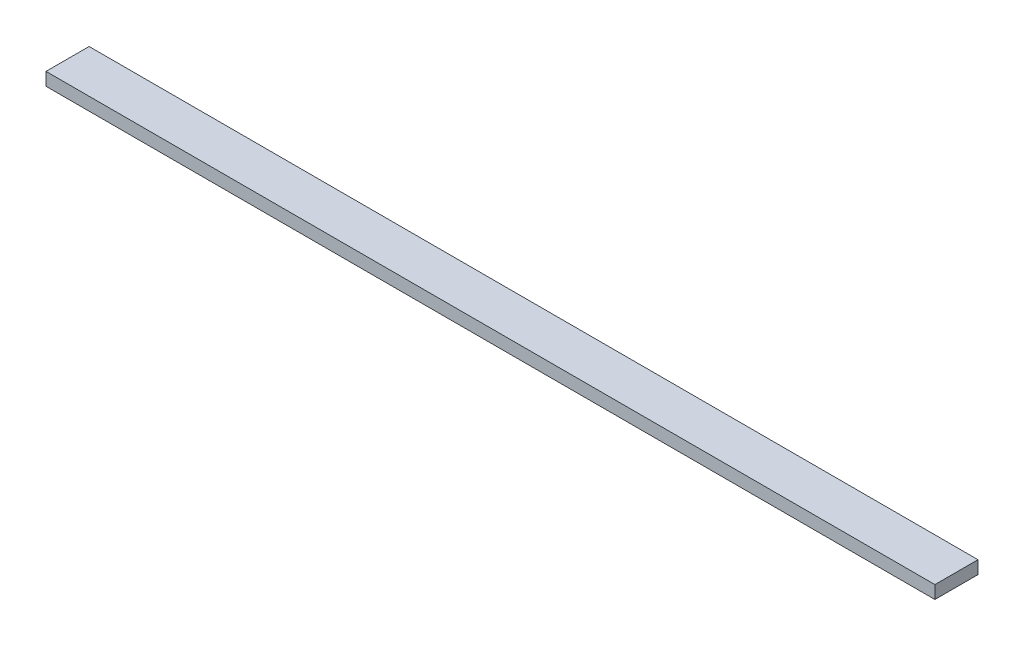
ISO-10303-21;
HEADER;
FILE_DESCRIPTION(('STEP AP214'),'2;1');
FILE_NAME('part.step','',(''),(''),'','','');
FILE_SCHEMA(('AUTOMOTIVE_DESIGN { 1 0 10303 214 1 1 1 1 }'));
ENDSEC;
DATA;
#1=APPLICATION_CONTEXT('core data for automotive mechanical design processes');
#2=APPLICATION_PROTOCOL_DEFINITION('international standard','automotive_design',2000,#1);
#3=PRODUCT_CONTEXT('',#1,'mechanical');
#4=PRODUCT('Part','Part','',(#3));
#5=PRODUCT_RELATED_PRODUCT_CATEGORY('part','',(#4));
#6=PRODUCT_DEFINITION_FORMATION('','',#4);
#7=PRODUCT_DEFINITION_CONTEXT('part definition',#1,'design');
#8=PRODUCT_DEFINITION('design','',#6,#7);
#9=PRODUCT_DEFINITION_SHAPE('','',#8);
#10=(LENGTH_UNIT() NAMED_UNIT(*) SI_UNIT(.MILLI.,.METRE.));
#11=(NAMED_UNIT(*) PLANE_ANGLE_UNIT() SI_UNIT($,.RADIAN.));
#12=(NAMED_UNIT(*) SI_UNIT($,.STERADIAN.) SOLID_ANGLE_UNIT());
#13=UNCERTAINTY_MEASURE_WITH_UNIT(LENGTH_MEASURE(1.E-05),#10,'distance_accuracy_value','');
#14=(GEOMETRIC_REPRESENTATION_CONTEXT(3) GLOBAL_UNCERTAINTY_ASSIGNED_CONTEXT((#13)) GLOBAL_UNIT_ASSIGNED_CONTEXT((#10,
#11,#12)) REPRESENTATION_CONTEXT('',''));
#15=CARTESIAN_POINT('',(0.,0.,0.));
#16=DIRECTION('',(0.,0.,1.));
#17=DIRECTION('',(1.,0.,0.));
#18=AXIS2_PLACEMENT_3D('',#15,#16,#17);
#19=CARTESIAN_POINT('',(-103.12,3.,-9.99999999999997));
#20=DIRECTION('',(0.,0.,1.));
#21=DIRECTION('',(1.,0.,0.));
#22=AXIS2_PLACEMENT_3D('',#19,#20,#21);
#23=PLANE('',#22);
#24=DIRECTION('',(-1.,0.,0.));
#25=VECTOR('',#24,1.);
#26=CARTESIAN_POINT('',(-103.12,0.,-9.99999999999997));
#27=LINE('',#26,#25);
#28=CARTESIAN_POINT('',(103.12,0.,-9.99999999999997));
#29=VERTEX_POINT('',#28);
#30=CARTESIAN_POINT('',(-103.12,0.,-9.99999999999997));
#31=VERTEX_POINT('',#30);
#32=EDGE_CURVE('E99',#29,#31,#27,.T.);
#33=ORIENTED_EDGE('',*,*,#32,.T.);
#34=DIRECTION('',(0.,-1.,0.));
#35=VECTOR('',#34,1.);
#36=CARTESIAN_POINT('',(-103.12,3.,-9.99999999999997));
#37=LINE('',#36,#35);
#38=CARTESIAN_POINT('',(-103.12,3.,-9.99999999999997));
#39=VERTEX_POINT('',#38);
#40=EDGE_CURVE('E11',#39,#31,#37,.T.);
#41=ORIENTED_EDGE('',*,*,#40,.F.);
#42=DIRECTION('',(-1.,0.,0.));
#43=VECTOR('',#42,1.);
#44=CARTESIAN_POINT('',(-103.12,3.,-9.99999999999997));
#45=LINE('',#44,#43);
#46=CARTESIAN_POINT('',(103.12,3.,-9.99999999999997));
#47=VERTEX_POINT('',#46);
#48=EDGE_CURVE('E87',#47,#39,#45,.T.);
#49=ORIENTED_EDGE('',*,*,#48,.F.);
#50=DIRECTION('',(0.,-1.,0.));
#51=VECTOR('',#50,1.);
#52=CARTESIAN_POINT('',(103.12,3.,-9.99999999999997));
#53=LINE('',#52,#51);
#54=EDGE_CURVE('E95',#47,#29,#53,.T.);
#55=ORIENTED_EDGE('',*,*,#54,.T.);
#56=EDGE_LOOP('',(#33,#41,#49,#55));
#57=FACE_BOUND('',#56,.T.);
#58=ADVANCED_FACE('F36',(#57),#23,.F.);
#59=CARTESIAN_POINT('',(-103.12,3.,0.));
#60=DIRECTION('',(1.,0.,0.));
#61=DIRECTION('',(0.,0.,-1.));
#62=AXIS2_PLACEMENT_3D('',#59,#60,#61);
#63=PLANE('',#62);
#64=DIRECTION('',(0.,0.,1.));
#65=VECTOR('',#64,1.);
#66=CARTESIAN_POINT('',(-103.12,0.,0.));
#67=LINE('',#66,#65);
#68=CARTESIAN_POINT('',(-103.12,0.,0.));
#69=VERTEX_POINT('',#68);
#70=EDGE_CURVE('E91',#31,#69,#67,.T.);
#71=ORIENTED_EDGE('',*,*,#70,.T.);
#72=DIRECTION('',(0.,-1.,0.));
#73=VECTOR('',#72,1.);
#74=CARTESIAN_POINT('',(-103.12,3.,0.));
#75=LINE('',#74,#73);
#76=CARTESIAN_POINT('',(-103.12,3.,0.));
#77=VERTEX_POINT('',#76);
#78=EDGE_CURVE('E44',#77,#69,#75,.T.);
#79=ORIENTED_EDGE('',*,*,#78,.F.);
#80=DIRECTION('',(0.,0.,1.));
#81=VECTOR('',#80,1.);
#82=CARTESIAN_POINT('',(-103.12,3.,0.));
#83=LINE('',#82,#81);
#84=EDGE_CURVE('E82',#39,#77,#83,.T.);
#85=ORIENTED_EDGE('',*,*,#84,.F.);
#86=ORIENTED_EDGE('',*,*,#40,.T.);
#87=EDGE_LOOP('',(#71,#79,#85,#86));
#88=FACE_BOUND('',#87,.T.);
#89=ADVANCED_FACE('F90',(#88),#63,.F.);
#90=CARTESIAN_POINT('',(103.12,3.,0.));
#91=DIRECTION('',(0.,0.,-1.));
#92=DIRECTION('',(-1.,0.,0.));
#93=AXIS2_PLACEMENT_3D('',#90,#91,#92);
#94=PLANE('',#93);
#95=DIRECTION('',(1.,0.,0.));
#96=VECTOR('',#95,1.);
#97=CARTESIAN_POINT('',(103.12,0.,0.));
#98=LINE('',#97,#96);
#99=CARTESIAN_POINT('',(103.12,0.,0.));
#100=VERTEX_POINT('',#99);
#101=EDGE_CURVE('E69',#69,#100,#98,.T.);
#102=ORIENTED_EDGE('',*,*,#101,.T.);
#103=DIRECTION('',(0.,-1.,0.));
#104=VECTOR('',#103,1.);
#105=CARTESIAN_POINT('',(103.12,3.,0.));
#106=LINE('',#105,#104);
#107=CARTESIAN_POINT('',(103.12,3.,0.));
#108=VERTEX_POINT('',#107);
#109=EDGE_CURVE('E92',#108,#100,#106,.T.);
#110=ORIENTED_EDGE('',*,*,#109,.F.);
#111=DIRECTION('',(1.,0.,0.));
#112=VECTOR('',#111,1.);
#113=CARTESIAN_POINT('',(103.12,3.,0.));
#114=LINE('',#113,#112);
#115=EDGE_CURVE('E85',#77,#108,#114,.T.);
#116=ORIENTED_EDGE('',*,*,#115,.F.);
#117=ORIENTED_EDGE('',*,*,#78,.T.);
#118=EDGE_LOOP('',(#102,#110,#116,#117));
#119=FACE_BOUND('',#118,.T.);
#120=ADVANCED_FACE('F93',(#119),#94,.F.);
#121=CARTESIAN_POINT('',(103.12,3.,-9.99999999999997));
#122=DIRECTION('',(-1.,0.,0.));
#123=DIRECTION('',(0.,0.,1.));
#124=AXIS2_PLACEMENT_3D('',#121,#122,#123);
#125=PLANE('',#124);
#126=DIRECTION('',(0.,0.,-1.));
#127=VECTOR('',#126,1.);
#128=CARTESIAN_POINT('',(103.12,0.,-9.99999999999997));
#129=LINE('',#128,#127);
#130=EDGE_CURVE('E75',#100,#29,#129,.T.);
#131=ORIENTED_EDGE('',*,*,#130,.T.);
#132=ORIENTED_EDGE('',*,*,#54,.F.);
#133=DIRECTION('',(0.,0.,-1.));
#134=VECTOR('',#133,1.);
#135=CARTESIAN_POINT('',(103.12,3.,-9.99999999999997));
#136=LINE('',#135,#134);
#137=EDGE_CURVE('E52',#108,#47,#136,.T.);
#138=ORIENTED_EDGE('',*,*,#137,.F.);
#139=ORIENTED_EDGE('',*,*,#109,.T.);
#140=EDGE_LOOP('',(#131,#132,#138,#139));
#141=FACE_BOUND('',#140,.T.);
#142=ADVANCED_FACE('F106',(#141),#125,.F.);
#143=CARTESIAN_POINT('',(0.,3.,0.));
#144=DIRECTION('',(0.,-1.,0.));
#145=DIRECTION('',(0.,0.,-1.));
#146=AXIS2_PLACEMENT_3D('',#143,#144,#145);
#147=PLANE('',#146);
#148=ORIENTED_EDGE('',*,*,#48,.T.);
#149=ORIENTED_EDGE('',*,*,#84,.T.);
#150=ORIENTED_EDGE('',*,*,#115,.T.);
#151=ORIENTED_EDGE('',*,*,#137,.T.);
#152=EDGE_LOOP('',(#148,#149,#150,#151));
#153=FACE_BOUND('',#152,.T.);
#154=ADVANCED_FACE('F83',(#153),#147,.F.);
#155=CARTESIAN_POINT('',(0.,0.,0.));
#156=DIRECTION('',(0.,-1.,0.));
#157=DIRECTION('',(0.,0.,-1.));
#158=AXIS2_PLACEMENT_3D('',#155,#156,#157);
#159=PLANE('',#158);
#160=ORIENTED_EDGE('',*,*,#32,.F.);
#161=ORIENTED_EDGE('',*,*,#130,.F.);
#162=ORIENTED_EDGE('',*,*,#101,.F.);
#163=ORIENTED_EDGE('',*,*,#70,.F.);
#164=EDGE_LOOP('',(#160,#161,#162,#163));
#165=FACE_BOUND('',#164,.T.);
#166=ADVANCED_FACE('F109',(#165),#159,.T.);
#167=CLOSED_SHELL('',(#58,#89,#120,#142,#154,#166));
#168=MANIFOLD_SOLID_BREP('B2',#167);
#169=ADVANCED_BREP_SHAPE_REPRESENTATION('',(#18,#168),#14);
#170=SHAPE_DEFINITION_REPRESENTATION(#9,#169);
ENDSEC;
END-ISO-10303-21;
